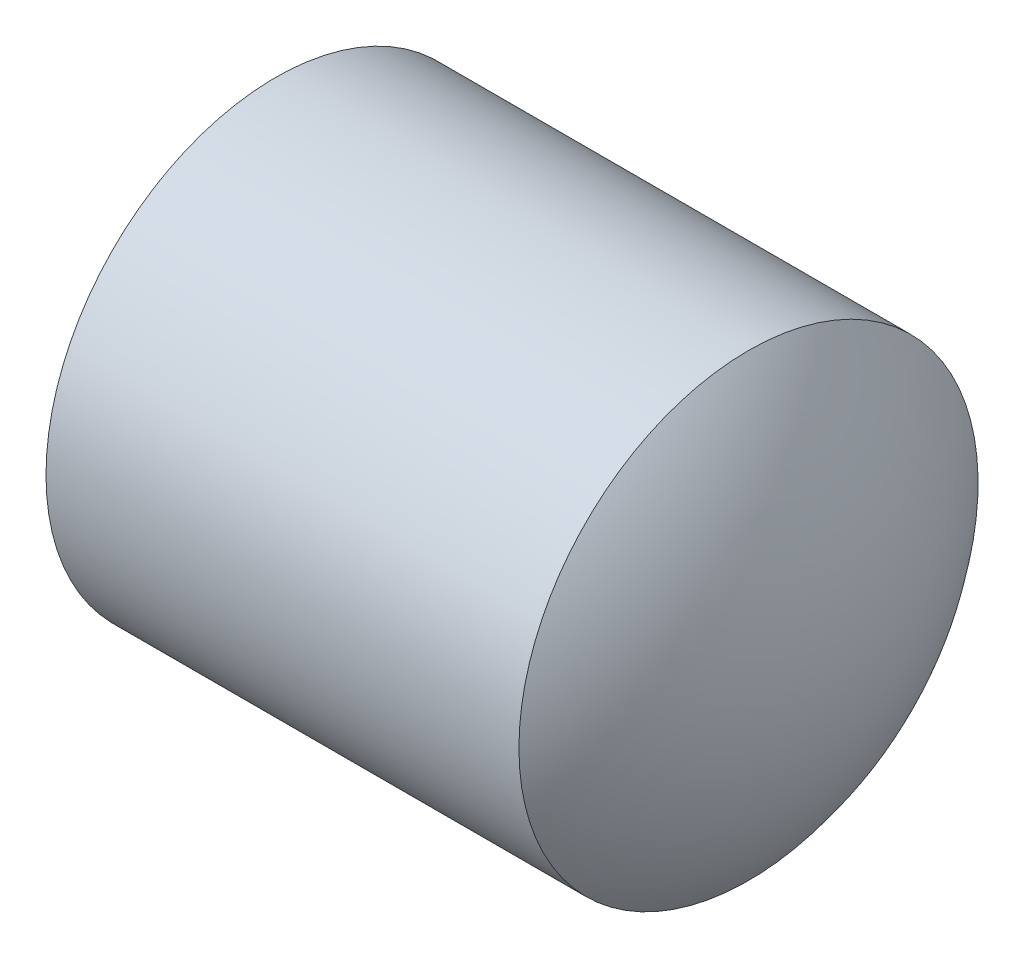
ISO-10303-21;
HEADER;
FILE_DESCRIPTION(('STEP AP214'),'2;1');
FILE_NAME('part.step','',(''),(''),'','','');
FILE_SCHEMA(('AUTOMOTIVE_DESIGN { 1 0 10303 214 1 1 1 1 }'));
ENDSEC;
DATA;
#1=APPLICATION_CONTEXT('core data for automotive mechanical design processes');
#2=APPLICATION_PROTOCOL_DEFINITION('international standard','automotive_design',2000,#1);
#3=PRODUCT_CONTEXT('',#1,'mechanical');
#4=PRODUCT('Part','Part','',(#3));
#5=PRODUCT_RELATED_PRODUCT_CATEGORY('part','',(#4));
#6=PRODUCT_DEFINITION_FORMATION('','',#4);
#7=PRODUCT_DEFINITION_CONTEXT('part definition',#1,'design');
#8=PRODUCT_DEFINITION('design','',#6,#7);
#9=PRODUCT_DEFINITION_SHAPE('','',#8);
#10=(LENGTH_UNIT() NAMED_UNIT(*) SI_UNIT(.MILLI.,.METRE.));
#11=(NAMED_UNIT(*) PLANE_ANGLE_UNIT() SI_UNIT($,.RADIAN.));
#12=(NAMED_UNIT(*) SI_UNIT($,.STERADIAN.) SOLID_ANGLE_UNIT());
#13=UNCERTAINTY_MEASURE_WITH_UNIT(LENGTH_MEASURE(1.E-05),#10,'distance_accuracy_value','');
#14=(GEOMETRIC_REPRESENTATION_CONTEXT(3) GLOBAL_UNCERTAINTY_ASSIGNED_CONTEXT((#13)) GLOBAL_UNIT_ASSIGNED_CONTEXT((#10,
#11,#12)) REPRESENTATION_CONTEXT('',''));
#15=CARTESIAN_POINT('',(0.,0.,0.));
#16=DIRECTION('',(0.,0.,1.));
#17=DIRECTION('',(1.,0.,0.));
#18=AXIS2_PLACEMENT_3D('',#15,#16,#17);
#19=CARTESIAN_POINT('',(0.,0.,0.));
#20=DIRECTION('',(-1.,0.,0.));
#21=DIRECTION('',(0.,0.,1.));
#22=AXIS2_PLACEMENT_3D('',#19,#20,#21);
#23=PLANE('',#22);
#24=CARTESIAN_POINT('',(0.,0.,0.));
#25=DIRECTION('',(-1.,0.,0.));
#26=DIRECTION('',(0.,0.,1.));
#27=AXIS2_PLACEMENT_3D('',#24,#25,#26);
#28=CIRCLE('',#27,10.352);
#29=CARTESIAN_POINT('',(0.,0.,10.352));
#30=VERTEX_POINT('',#29);
#31=EDGE_CURVE('E136',#30,#30,#28,.T.);
#32=ORIENTED_EDGE('',*,*,#31,.T.);
#33=EDGE_LOOP('',(#32));
#34=FACE_BOUND('',#33,.T.);
#35=DIRECTION('',(0.,0.,-1.));
#36=VECTOR('',#35,1.);
#37=CARTESIAN_POINT('',(0.,6.,3.46410161513775));
#38=LINE('',#37,#36);
#39=CARTESIAN_POINT('',(0.,6.,3.46410161513775));
#40=VERTEX_POINT('',#39);
#41=CARTESIAN_POINT('',(0.,6.,-3.46410161513775));
#42=VERTEX_POINT('',#41);
#43=EDGE_CURVE('E127',#40,#42,#38,.T.);
#44=ORIENTED_EDGE('',*,*,#43,.F.);
#45=DIRECTION('',(0.,-0.866025403784438,0.5));
#46=VECTOR('',#45,1.);
#47=CARTESIAN_POINT('',(0.,6.,3.46410161513775));
#48=LINE('',#47,#46);
#49=CARTESIAN_POINT('',(0.,0.,6.92820323027551));
#50=VERTEX_POINT('',#49);
#51=EDGE_CURVE('E49',#40,#50,#48,.T.);
#52=ORIENTED_EDGE('',*,*,#51,.T.);
#53=DIRECTION('',(0.,0.866025403784439,0.5));
#54=VECTOR('',#53,1.);
#55=CARTESIAN_POINT('',(0.,-5.99999999999999,3.46410161513775));
#56=LINE('',#55,#54);
#57=CARTESIAN_POINT('',(0.,-5.99999999999999,3.46410161513775));
#58=VERTEX_POINT('',#57);
#59=EDGE_CURVE('E118',#58,#50,#56,.T.);
#60=ORIENTED_EDGE('',*,*,#59,.F.);
#61=DIRECTION('',(0.,0.,-1.));
#62=VECTOR('',#61,1.);
#63=CARTESIAN_POINT('',(0.,-5.99999999999999,3.46410161513775));
#64=LINE('',#63,#62);
#65=CARTESIAN_POINT('',(0.,-5.99999999999999,-3.46410161513775));
#66=VERTEX_POINT('',#65);
#67=EDGE_CURVE('E121',#58,#66,#64,.T.);
#68=ORIENTED_EDGE('',*,*,#67,.T.);
#69=DIRECTION('',(0.,0.866025403784439,-0.5));
#70=VECTOR('',#69,1.);
#71=CARTESIAN_POINT('',(0.,-5.99999999999999,-3.46410161513775));
#72=LINE('',#71,#70);
#73=CARTESIAN_POINT('',(0.,0.,-6.92820323027551));
#74=VERTEX_POINT('',#73);
#75=EDGE_CURVE('E124',#66,#74,#72,.T.);
#76=ORIENTED_EDGE('',*,*,#75,.T.);
#77=DIRECTION('',(0.,-0.866025403784439,-0.5));
#78=VECTOR('',#77,1.);
#79=CARTESIAN_POINT('',(0.,6.,-3.46410161513775));
#80=LINE('',#79,#78);
#81=EDGE_CURVE('E107',#42,#74,#80,.T.);
#82=ORIENTED_EDGE('',*,*,#81,.F.);
#83=EDGE_LOOP('',(#44,#52,#60,#68,#76,#82));
#84=FACE_BOUND('',#83,.T.);
#85=ADVANCED_FACE('F34',(#34,#84),#23,.T.);
#86=CARTESIAN_POINT('',(11.2,0.,0.));
#87=DIRECTION('',(-1.,0.,0.));
#88=DIRECTION('',(0.,1.,0.));
#89=AXIS2_PLACEMENT_3D('',#86,#87,#88);
#90=SPHERICAL_SURFACE('',#89,18.8);
#91=CARTESIAN_POINT('',(25.6720420121004,0.,0.));
#92=DIRECTION('',(-1.,0.,0.));
#93=DIRECTION('',(0.,0.,1.));
#94=AXIS2_PLACEMENT_3D('',#91,#92,#93);
#95=CIRCLE('',#94,12.);
#96=CARTESIAN_POINT('',(25.6720420121004,0.,12.));
#97=VERTEX_POINT('',#96);
#98=EDGE_CURVE('E11',#97,#97,#95,.T.);
#99=ORIENTED_EDGE('',*,*,#98,.F.);
#100=EDGE_LOOP('',(#99));
#101=FACE_BOUND('',#100,.T.);
#102=ADVANCED_FACE('F36',(#101),#90,.T.);
#103=CARTESIAN_POINT('',(-12.7,0.,0.));
#104=DIRECTION('',(-1.,0.,0.));
#105=DIRECTION('',(0.,0.,1.));
#106=AXIS2_PLACEMENT_3D('',#103,#104,#105);
#107=CYLINDRICAL_SURFACE('',#106,12.);
#108=ORIENTED_EDGE('',*,*,#98,.T.);
#109=EDGE_LOOP('',(#108));
#110=FACE_BOUND('',#109,.T.);
#111=CARTESIAN_POINT('',(0.951473243624452,0.,0.));
#112=DIRECTION('',(-1.,0.,0.));
#113=DIRECTION('',(0.,0.,1.));
#114=AXIS2_PLACEMENT_3D('',#111,#112,#113);
#115=CIRCLE('',#114,12.);
#116=CARTESIAN_POINT('',(0.951473243624452,0.,12.));
#117=VERTEX_POINT('',#116);
#118=EDGE_CURVE('E42',#117,#117,#115,.T.);
#119=ORIENTED_EDGE('',*,*,#118,.F.);
#120=EDGE_LOOP('',(#119));
#121=FACE_BOUND('',#120,.T.);
#122=ADVANCED_FACE('F144',(#110,#121),#107,.T.);
#123=CARTESIAN_POINT('',(0.,0.,0.));
#124=DIRECTION('',(1.,0.,0.));
#125=DIRECTION('',(0.,0.,-1.));
#126=AXIS2_PLACEMENT_3D('',#123,#124,#125);
#127=CONICAL_SURFACE('',#126,10.352,1.04719755119662);
#128=ORIENTED_EDGE('',*,*,#118,.T.);
#129=EDGE_LOOP('',(#128));
#130=FACE_BOUND('',#129,.T.);
#131=ORIENTED_EDGE('',*,*,#31,.F.);
#132=EDGE_LOOP('',(#131));
#133=FACE_BOUND('',#132,.T.);
#134=ADVANCED_FACE('F141',(#130,#133),#127,.T.);
#135=CARTESIAN_POINT('',(12.,6.,3.46410161513775));
#136=DIRECTION('',(0.,-0.5,-0.866025403784438));
#137=DIRECTION('',(0.,0.866025403784439,-0.5));
#138=AXIS2_PLACEMENT_3D('',#135,#136,#137);
#139=PLANE('',#138);
#140=ORIENTED_EDGE('',*,*,#51,.F.);
#141=DIRECTION('',(-1.,0.,0.));
#142=VECTOR('',#141,1.);
#143=CARTESIAN_POINT('',(12.,6.,3.46410161513775));
#144=LINE('',#143,#142);
#145=CARTESIAN_POINT('',(12.,6.,3.46410161513775));
#146=VERTEX_POINT('',#145);
#147=EDGE_CURVE('E54',#146,#40,#144,.T.);
#148=ORIENTED_EDGE('',*,*,#147,.F.);
#149=DIRECTION('',(0.,-0.866025403784438,0.5));
#150=VECTOR('',#149,1.);
#151=CARTESIAN_POINT('',(12.,6.,3.46410161513775));
#152=LINE('',#151,#150);
#153=CARTESIAN_POINT('',(12.,0.,6.92820323027551));
#154=VERTEX_POINT('',#153);
#155=EDGE_CURVE('E81',#146,#154,#152,.T.);
#156=ORIENTED_EDGE('',*,*,#155,.T.);
#157=DIRECTION('',(-1.,0.,0.));
#158=VECTOR('',#157,1.);
#159=CARTESIAN_POINT('',(12.,0.,6.92820323027551));
#160=LINE('',#159,#158);
#161=EDGE_CURVE('E134',#154,#50,#160,.T.);
#162=ORIENTED_EDGE('',*,*,#161,.T.);
#163=EDGE_LOOP('',(#140,#148,#156,#162));
#164=FACE_BOUND('',#163,.T.);
#165=ADVANCED_FACE('F151',(#164),#139,.T.);
#166=CARTESIAN_POINT('',(12.,-5.99999999999999,3.46410161513775));
#167=DIRECTION('',(0.,-0.5,0.866025403784438));
#168=DIRECTION('',(0.,-0.866025403784439,-0.5));
#169=AXIS2_PLACEMENT_3D('',#166,#167,#168);
#170=PLANE('',#169);
#171=ORIENTED_EDGE('',*,*,#59,.T.);
#172=ORIENTED_EDGE('',*,*,#161,.F.);
#173=DIRECTION('',(0.,0.866025403784439,0.5));
#174=VECTOR('',#173,1.);
#175=CARTESIAN_POINT('',(12.,-5.99999999999999,3.46410161513775));
#176=LINE('',#175,#174);
#177=CARTESIAN_POINT('',(12.,-5.99999999999999,3.46410161513775));
#178=VERTEX_POINT('',#177);
#179=EDGE_CURVE('E249',#178,#154,#176,.T.);
#180=ORIENTED_EDGE('',*,*,#179,.F.);
#181=DIRECTION('',(-1.,0.,0.));
#182=VECTOR('',#181,1.);
#183=CARTESIAN_POINT('',(12.,-5.99999999999999,3.46410161513775));
#184=LINE('',#183,#182);
#185=EDGE_CURVE('E132',#178,#58,#184,.T.);
#186=ORIENTED_EDGE('',*,*,#185,.T.);
#187=EDGE_LOOP('',(#171,#172,#180,#186));
#188=FACE_BOUND('',#187,.T.);
#189=ADVANCED_FACE('F163',(#188),#170,.F.);
#190=CARTESIAN_POINT('',(12.,-5.99999999999999,3.46410161513775));
#191=DIRECTION('',(0.,1.,0.));
#192=DIRECTION('',(0.,0.,1.));
#193=AXIS2_PLACEMENT_3D('',#190,#191,#192);
#194=PLANE('',#193);
#195=ORIENTED_EDGE('',*,*,#67,.F.);
#196=ORIENTED_EDGE('',*,*,#185,.F.);
#197=DIRECTION('',(0.,0.,-1.));
#198=VECTOR('',#197,1.);
#199=CARTESIAN_POINT('',(12.,-5.99999999999999,3.46410161513775));
#200=LINE('',#199,#198);
#201=CARTESIAN_POINT('',(12.,-5.99999999999999,-3.46410161513775));
#202=VERTEX_POINT('',#201);
#203=EDGE_CURVE('E102',#178,#202,#200,.T.);
#204=ORIENTED_EDGE('',*,*,#203,.T.);
#205=DIRECTION('',(-1.,0.,0.));
#206=VECTOR('',#205,1.);
#207=CARTESIAN_POINT('',(12.,-5.99999999999999,-3.46410161513775));
#208=LINE('',#207,#206);
#209=EDGE_CURVE('E97',#202,#66,#208,.T.);
#210=ORIENTED_EDGE('',*,*,#209,.T.);
#211=EDGE_LOOP('',(#195,#196,#204,#210));
#212=FACE_BOUND('',#211,.T.);
#213=ADVANCED_FACE('F166',(#212),#194,.T.);
#214=CARTESIAN_POINT('',(12.,-5.99999999999999,-3.46410161513775));
#215=DIRECTION('',(0.,0.5,0.866025403784438));
#216=DIRECTION('',(0.,-0.866025403784439,0.5));
#217=AXIS2_PLACEMENT_3D('',#214,#215,#216);
#218=PLANE('',#217);
#219=ORIENTED_EDGE('',*,*,#75,.F.);
#220=ORIENTED_EDGE('',*,*,#209,.F.);
#221=DIRECTION('',(0.,0.866025403784439,-0.5));
#222=VECTOR('',#221,1.);
#223=CARTESIAN_POINT('',(12.,-5.99999999999999,-3.46410161513775));
#224=LINE('',#223,#222);
#225=CARTESIAN_POINT('',(12.,0.,-6.92820323027551));
#226=VERTEX_POINT('',#225);
#227=EDGE_CURVE('E92',#202,#226,#224,.T.);
#228=ORIENTED_EDGE('',*,*,#227,.T.);
#229=DIRECTION('',(-1.,0.,0.));
#230=VECTOR('',#229,1.);
#231=CARTESIAN_POINT('',(12.,0.,-6.92820323027551));
#232=LINE('',#231,#230);
#233=EDGE_CURVE('E96',#226,#74,#232,.T.);
#234=ORIENTED_EDGE('',*,*,#233,.T.);
#235=EDGE_LOOP('',(#219,#220,#228,#234));
#236=FACE_BOUND('',#235,.T.);
#237=ADVANCED_FACE('F95',(#236),#218,.T.);
#238=CARTESIAN_POINT('',(12.,6.,-3.46410161513775));
#239=DIRECTION('',(0.,0.5,-0.866025403784439));
#240=DIRECTION('',(0.,0.866025403784439,0.5));
#241=AXIS2_PLACEMENT_3D('',#238,#239,#240);
#242=PLANE('',#241);
#243=ORIENTED_EDGE('',*,*,#81,.T.);
#244=ORIENTED_EDGE('',*,*,#233,.F.);
#245=DIRECTION('',(0.,-0.866025403784439,-0.5));
#246=VECTOR('',#245,1.);
#247=CARTESIAN_POINT('',(12.,6.,-3.46410161513775));
#248=LINE('',#247,#246);
#249=CARTESIAN_POINT('',(12.,6.,-3.46410161513775));
#250=VERTEX_POINT('',#249);
#251=EDGE_CURVE('E101',#250,#226,#248,.T.);
#252=ORIENTED_EDGE('',*,*,#251,.F.);
#253=DIRECTION('',(-1.,0.,0.));
#254=VECTOR('',#253,1.);
#255=CARTESIAN_POINT('',(12.,6.,-3.46410161513775));
#256=LINE('',#255,#254);
#257=EDGE_CURVE('E77',#250,#42,#256,.T.);
#258=ORIENTED_EDGE('',*,*,#257,.T.);
#259=EDGE_LOOP('',(#243,#244,#252,#258));
#260=FACE_BOUND('',#259,.T.);
#261=ADVANCED_FACE('F104',(#260),#242,.F.);
#262=CARTESIAN_POINT('',(12.,6.,3.46410161513775));
#263=DIRECTION('',(0.,1.,0.));
#264=DIRECTION('',(0.,0.,1.));
#265=AXIS2_PLACEMENT_3D('',#262,#263,#264);
#266=PLANE('',#265);
#267=ORIENTED_EDGE('',*,*,#43,.T.);
#268=ORIENTED_EDGE('',*,*,#257,.F.);
#269=DIRECTION('',(0.,0.,-1.));
#270=VECTOR('',#269,1.);
#271=CARTESIAN_POINT('',(12.,6.,3.46410161513775));
#272=LINE('',#271,#270);
#273=EDGE_CURVE('E112',#146,#250,#272,.T.);
#274=ORIENTED_EDGE('',*,*,#273,.F.);
#275=ORIENTED_EDGE('',*,*,#147,.T.);
#276=EDGE_LOOP('',(#267,#268,#274,#275));
#277=FACE_BOUND('',#276,.T.);
#278=ADVANCED_FACE('F175',(#277),#266,.F.);
#279=CARTESIAN_POINT('',(12.,0.,6.92820323027551));
#280=DIRECTION('',(-1.,0.,0.));
#281=DIRECTION('',(0.,0.,1.));
#282=AXIS2_PLACEMENT_3D('',#279,#280,#281);
#283=PLANE('',#282);
#284=ORIENTED_EDGE('',*,*,#155,.F.);
#285=ORIENTED_EDGE('',*,*,#273,.T.);
#286=ORIENTED_EDGE('',*,*,#251,.T.);
#287=ORIENTED_EDGE('',*,*,#227,.F.);
#288=ORIENTED_EDGE('',*,*,#203,.F.);
#289=ORIENTED_EDGE('',*,*,#179,.T.);
#290=EDGE_LOOP('',(#284,#285,#286,#287,#288,#289));
#291=FACE_BOUND('',#290,.T.);
#292=ADVANCED_FACE('F110',(#291),#283,.T.);
#293=CLOSED_SHELL('',(#85,#102,#122,#134,#165,#189,#213,#237,#261,#278,#292));
#294=MANIFOLD_SOLID_BREP('B2',#293);
#295=ADVANCED_BREP_SHAPE_REPRESENTATION('',(#18,#294),#14);
#296=SHAPE_DEFINITION_REPRESENTATION(#9,#295);
ENDSEC;
END-ISO-10303-21;
